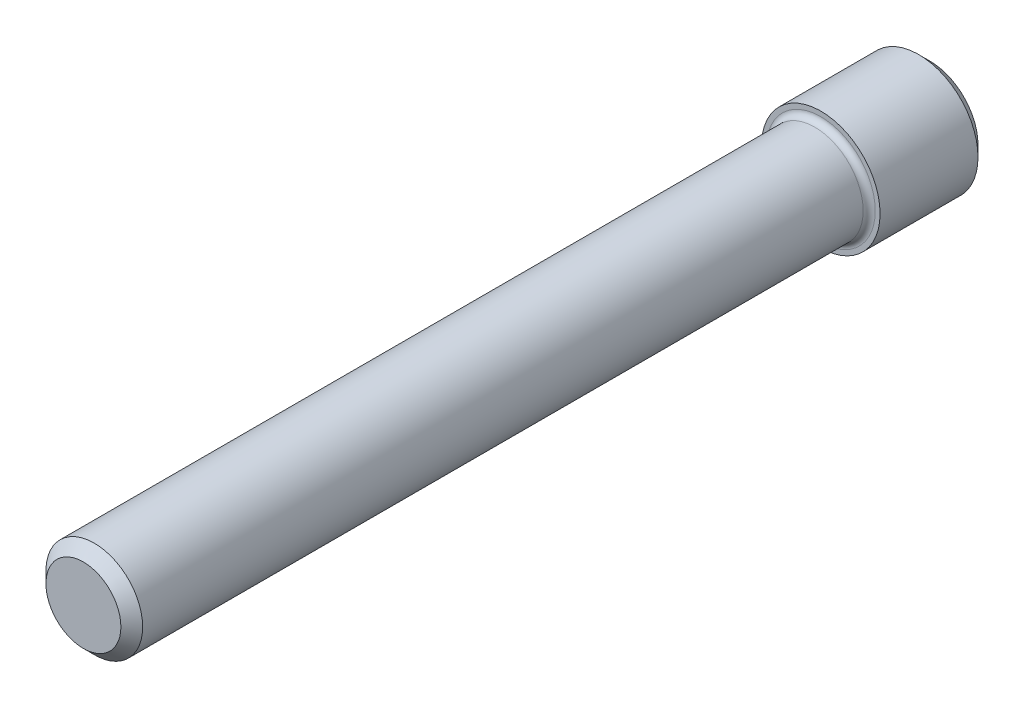
ISO-10303-21;
HEADER;
FILE_DESCRIPTION(('STEP AP214'),'2;1');
FILE_NAME('part.step','',(''),(''),'','','');
FILE_SCHEMA(('AUTOMOTIVE_DESIGN { 1 0 10303 214 1 1 1 1 }'));
ENDSEC;
DATA;
#1=APPLICATION_CONTEXT('core data for automotive mechanical design processes');
#2=APPLICATION_PROTOCOL_DEFINITION('international standard','automotive_design',2000,#1);
#3=PRODUCT_CONTEXT('',#1,'mechanical');
#4=PRODUCT('Part','Part','',(#3));
#5=PRODUCT_RELATED_PRODUCT_CATEGORY('part','',(#4));
#6=PRODUCT_DEFINITION_FORMATION('','',#4);
#7=PRODUCT_DEFINITION_CONTEXT('part definition',#1,'design');
#8=PRODUCT_DEFINITION('design','',#6,#7);
#9=PRODUCT_DEFINITION_SHAPE('','',#8);
#10=(LENGTH_UNIT() NAMED_UNIT(*) SI_UNIT(.MILLI.,.METRE.));
#11=(NAMED_UNIT(*) PLANE_ANGLE_UNIT() SI_UNIT($,.RADIAN.));
#12=(NAMED_UNIT(*) SI_UNIT($,.STERADIAN.) SOLID_ANGLE_UNIT());
#13=UNCERTAINTY_MEASURE_WITH_UNIT(LENGTH_MEASURE(1.E-05),#10,'distance_accuracy_value','');
#14=(GEOMETRIC_REPRESENTATION_CONTEXT(3) GLOBAL_UNCERTAINTY_ASSIGNED_CONTEXT((#13)) GLOBAL_UNIT_ASSIGNED_CONTEXT((#10,
#11,#12)) REPRESENTATION_CONTEXT('',''));
#15=CARTESIAN_POINT('',(0.,0.,0.));
#16=DIRECTION('',(0.,0.,1.));
#17=DIRECTION('',(1.,0.,0.));
#18=AXIS2_PLACEMENT_3D('',#15,#16,#17);
#19=CARTESIAN_POINT('',(0.,3.99999999999999,-70.));
#20=DIRECTION('',(0.,0.,1.));
#21=DIRECTION('',(1.,0.,0.));
#22=AXIS2_PLACEMENT_3D('',#19,#20,#21);
#23=PLANE('',#22);
#24=CARTESIAN_POINT('',(0.,0.,-70.));
#25=DIRECTION('',(0.,0.,1.));
#26=DIRECTION('',(1.,0.,0.));
#27=AXIS2_PLACEMENT_3D('',#24,#25,#26);
#28=CIRCLE('',#27,3.99999999999999);
#29=CARTESIAN_POINT('',(3.99999999999999,0.,-70.));
#30=VERTEX_POINT('',#29);
#31=EDGE_CURVE('E10',#30,#30,#28,.T.);
#32=ORIENTED_EDGE('',*,*,#31,.F.);
#33=EDGE_LOOP('',(#32));
#34=FACE_BOUND('',#33,.T.);
#35=ADVANCED_FACE('F30',(#34),#23,.F.);
#36=CARTESIAN_POINT('',(0.,0.,-70.));
#37=DIRECTION('',(0.,0.,1.));
#38=DIRECTION('',(1.,0.,0.));
#39=AXIS2_PLACEMENT_3D('',#36,#37,#38);
#40=CONICAL_SURFACE('',#39,3.99999999999999,0.785398163397454);
#41=CARTESIAN_POINT('',(0.,0.,-69.1));
#42=DIRECTION('',(0.,0.,1.));
#43=DIRECTION('',(1.,0.,0.));
#44=AXIS2_PLACEMENT_3D('',#41,#42,#43);
#45=CIRCLE('',#44,4.9);
#46=CARTESIAN_POINT('',(4.9,0.,-69.1));
#47=VERTEX_POINT('',#46);
#48=EDGE_CURVE('E36',#47,#47,#45,.T.);
#49=ORIENTED_EDGE('',*,*,#48,.F.);
#50=EDGE_LOOP('',(#49));
#51=FACE_BOUND('',#50,.T.);
#52=ORIENTED_EDGE('',*,*,#31,.T.);
#53=EDGE_LOOP('',(#52));
#54=FACE_BOUND('',#53,.T.);
#55=ADVANCED_FACE('F87',(#51,#54),#40,.T.);
#56=CARTESIAN_POINT('',(0.,0.,0.));
#57=DIRECTION('',(0.,0.,1.));
#58=DIRECTION('',(1.,0.,0.));
#59=AXIS2_PLACEMENT_3D('',#56,#57,#58);
#60=CYLINDRICAL_SURFACE('',#59,4.9);
#61=CARTESIAN_POINT('',(0.,0.,-61.));
#62=DIRECTION('',(0.,0.,1.));
#63=DIRECTION('',(1.,0.,0.));
#64=AXIS2_PLACEMENT_3D('',#61,#62,#63);
#65=CIRCLE('',#64,4.9);
#66=CARTESIAN_POINT('',(4.9,0.,-61.));
#67=VERTEX_POINT('',#66);
#68=EDGE_CURVE('E40',#67,#67,#65,.T.);
#69=ORIENTED_EDGE('',*,*,#68,.F.);
#70=EDGE_LOOP('',(#69));
#71=FACE_BOUND('',#70,.T.);
#72=ORIENTED_EDGE('',*,*,#48,.T.);
#73=EDGE_LOOP('',(#72));
#74=FACE_BOUND('',#73,.T.);
#75=ADVANCED_FACE('F82',(#71,#74),#60,.T.);
#76=CARTESIAN_POINT('',(0.,4.5,-61.));
#77=DIRECTION('',(0.,0.,-1.));
#78=DIRECTION('',(-1.,0.,0.));
#79=AXIS2_PLACEMENT_3D('',#76,#77,#78);
#80=PLANE('',#79);
#81=CARTESIAN_POINT('',(0.,0.,-61.));
#82=DIRECTION('',(0.,0.,1.));
#83=DIRECTION('',(1.,0.,0.));
#84=AXIS2_PLACEMENT_3D('',#81,#82,#83);
#85=CIRCLE('',#84,4.5);
#86=CARTESIAN_POINT('',(4.5,0.,-61.));
#87=VERTEX_POINT('',#86);
#88=EDGE_CURVE('E44',#87,#87,#85,.T.);
#89=ORIENTED_EDGE('',*,*,#88,.F.);
#90=EDGE_LOOP('',(#89));
#91=FACE_BOUND('',#90,.T.);
#92=ORIENTED_EDGE('',*,*,#68,.T.);
#93=EDGE_LOOP('',(#92));
#94=FACE_BOUND('',#93,.T.);
#95=ADVANCED_FACE('F76',(#91,#94),#80,.F.);
#96=CARTESIAN_POINT('',(0.,0.,-60.5));
#97=DIRECTION('',(0.,0.,1.));
#98=DIRECTION('',(1.,0.,0.));
#99=AXIS2_PLACEMENT_3D('',#96,#97,#98);
#100=TOROIDAL_SURFACE('',#99,4.5,0.5);
#101=CARTESIAN_POINT('',(0.,0.,-60.5));
#102=DIRECTION('',(0.,0.,1.));
#103=DIRECTION('',(1.,0.,0.));
#104=AXIS2_PLACEMENT_3D('',#101,#102,#103);
#105=CIRCLE('',#104,4.);
#106=CARTESIAN_POINT('',(4.,0.,-60.5));
#107=VERTEX_POINT('',#106);
#108=EDGE_CURVE('E49',#107,#107,#105,.T.);
#109=ORIENTED_EDGE('',*,*,#108,.F.);
#110=EDGE_LOOP('',(#109));
#111=FACE_BOUND('',#110,.T.);
#112=ORIENTED_EDGE('',*,*,#88,.T.);
#113=EDGE_LOOP('',(#112));
#114=FACE_BOUND('',#113,.T.);
#115=ADVANCED_FACE('F70',(#111,#114),#100,.F.);
#116=CARTESIAN_POINT('',(0.,0.,0.));
#117=DIRECTION('',(0.,0.,1.));
#118=DIRECTION('',(1.,0.,0.));
#119=AXIS2_PLACEMENT_3D('',#116,#117,#118);
#120=CYLINDRICAL_SURFACE('',#119,4.);
#121=CARTESIAN_POINT('',(0.,0.,-0.9));
#122=DIRECTION('',(0.,0.,1.));
#123=DIRECTION('',(1.,0.,0.));
#124=AXIS2_PLACEMENT_3D('',#121,#122,#123);
#125=CIRCLE('',#124,4.);
#126=CARTESIAN_POINT('',(4.,0.,-0.9));
#127=VERTEX_POINT('',#126);
#128=EDGE_CURVE('E52',#127,#127,#125,.T.);
#129=ORIENTED_EDGE('',*,*,#128,.F.);
#130=EDGE_LOOP('',(#129));
#131=FACE_BOUND('',#130,.T.);
#132=ORIENTED_EDGE('',*,*,#108,.T.);
#133=EDGE_LOOP('',(#132));
#134=FACE_BOUND('',#133,.T.);
#135=ADVANCED_FACE('F64',(#131,#134),#120,.T.);
#136=CARTESIAN_POINT('',(0.,0.,-0.9));
#137=DIRECTION('',(0.,0.,-1.));
#138=DIRECTION('',(-1.,0.,0.));
#139=AXIS2_PLACEMENT_3D('',#136,#137,#138);
#140=CONICAL_SURFACE('',#139,4.,0.785398163397447);
#141=CARTESIAN_POINT('',(0.,0.,0.));
#142=DIRECTION('',(0.,0.,1.));
#143=DIRECTION('',(1.,0.,0.));
#144=AXIS2_PLACEMENT_3D('',#141,#142,#143);
#145=CIRCLE('',#144,3.1);
#146=CARTESIAN_POINT('',(3.1,0.,0.));
#147=VERTEX_POINT('',#146);
#148=EDGE_CURVE('E55',#147,#147,#145,.T.);
#149=ORIENTED_EDGE('',*,*,#148,.F.);
#150=EDGE_LOOP('',(#149));
#151=FACE_BOUND('',#150,.T.);
#152=ORIENTED_EDGE('',*,*,#128,.T.);
#153=EDGE_LOOP('',(#152));
#154=FACE_BOUND('',#153,.T.);
#155=ADVANCED_FACE('F61',(#151,#154),#140,.T.);
#156=CARTESIAN_POINT('',(0.,0.,0.));
#157=DIRECTION('',(0.,0.,-1.));
#158=DIRECTION('',(-1.,0.,0.));
#159=AXIS2_PLACEMENT_3D('',#156,#157,#158);
#160=PLANE('',#159);
#161=ORIENTED_EDGE('',*,*,#148,.T.);
#162=EDGE_LOOP('',(#161));
#163=FACE_BOUND('',#162,.T.);
#164=ADVANCED_FACE('F59',(#163),#160,.F.);
#165=CLOSED_SHELL('',(#35,#55,#75,#95,#115,#135,#155,#164));
#166=MANIFOLD_SOLID_BREP('B2',#165);
#167=ADVANCED_BREP_SHAPE_REPRESENTATION('',(#18,#166),#14);
#168=SHAPE_DEFINITION_REPRESENTATION(#9,#167);
ENDSEC;
END-ISO-10303-21;
